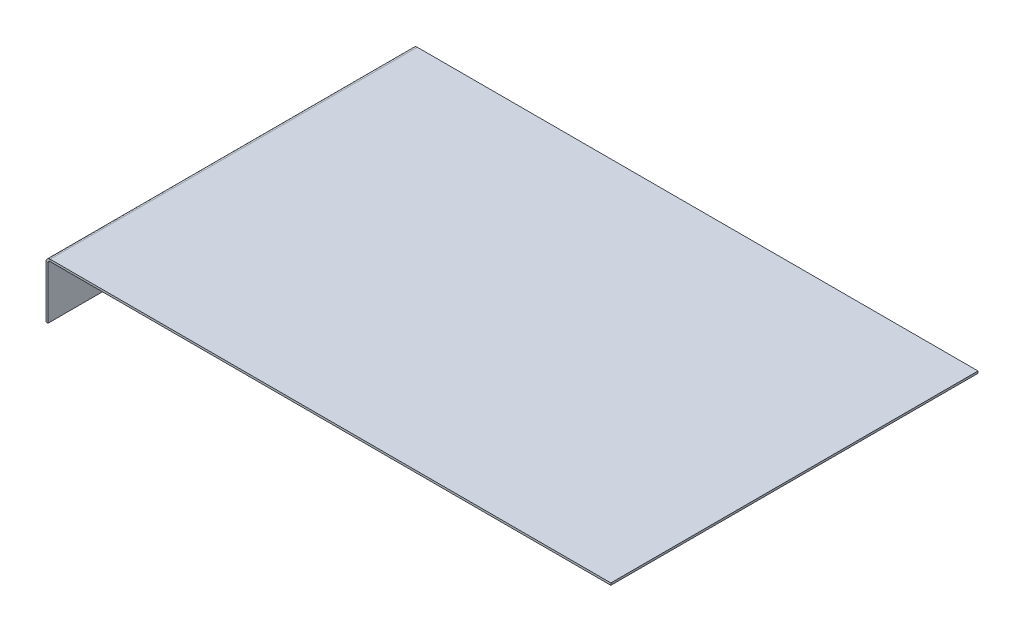
ISO-10303-21;
HEADER;
FILE_DESCRIPTION(('STEP AP214'),'2;1');
FILE_NAME('part.step','',(''),(''),'','','');
FILE_SCHEMA(('AUTOMOTIVE_DESIGN { 1 0 10303 214 1 1 1 1 }'));
ENDSEC;
DATA;
#1=APPLICATION_CONTEXT('core data for automotive mechanical design processes');
#2=APPLICATION_PROTOCOL_DEFINITION('international standard','automotive_design',2000,#1);
#3=PRODUCT_CONTEXT('',#1,'mechanical');
#4=PRODUCT('Part','Part','',(#3));
#5=PRODUCT_RELATED_PRODUCT_CATEGORY('part','',(#4));
#6=PRODUCT_DEFINITION_FORMATION('','',#4);
#7=PRODUCT_DEFINITION_CONTEXT('part definition',#1,'design');
#8=PRODUCT_DEFINITION('design','',#6,#7);
#9=PRODUCT_DEFINITION_SHAPE('','',#8);
#10=(LENGTH_UNIT() NAMED_UNIT(*) SI_UNIT(.MILLI.,.METRE.));
#11=(NAMED_UNIT(*) PLANE_ANGLE_UNIT() SI_UNIT($,.RADIAN.));
#12=(NAMED_UNIT(*) SI_UNIT($,.STERADIAN.) SOLID_ANGLE_UNIT());
#13=UNCERTAINTY_MEASURE_WITH_UNIT(LENGTH_MEASURE(1.E-05),#10,'distance_accuracy_value','');
#14=(GEOMETRIC_REPRESENTATION_CONTEXT(3) GLOBAL_UNCERTAINTY_ASSIGNED_CONTEXT((#13)) GLOBAL_UNIT_ASSIGNED_CONTEXT((#10,
#11,#12)) REPRESENTATION_CONTEXT('',''));
#15=CARTESIAN_POINT('',(0.,0.,0.));
#16=DIRECTION('',(0.,0.,1.));
#17=DIRECTION('',(1.,0.,0.));
#18=AXIS2_PLACEMENT_3D('',#15,#16,#17);
#19=CARTESIAN_POINT('',(-100.,-0.7366,-65.));
#20=DIRECTION('',(0.,0.,-1.));
#21=DIRECTION('',(-1.,0.,0.));
#22=AXIS2_PLACEMENT_3D('',#19,#20,#21);
#23=PLANE('',#22);
#24=DIRECTION('',(-1.,0.,0.));
#25=VECTOR('',#24,1.);
#26=CARTESIAN_POINT('',(-100.,-0.7366,-65.));
#27=LINE('',#26,#25);
#28=CARTESIAN_POINT('',(100.,-0.7366,-65.));
#29=VERTEX_POINT('',#28);
#30=CARTESIAN_POINT('',(-98.5268,-0.7366,-65.));
#31=VERTEX_POINT('',#30);
#32=EDGE_CURVE('E188',#29,#31,#27,.T.);
#33=ORIENTED_EDGE('',*,*,#32,.T.);
#34=DIRECTION('',(0.,1.,0.));
#35=VECTOR('',#34,1.);
#36=CARTESIAN_POINT('',(-98.5268,-0.736600000000006,-65.));
#37=LINE('',#36,#35);
#38=CARTESIAN_POINT('',(-98.5268,0.,-65.));
#39=VERTEX_POINT('',#38);
#40=EDGE_CURVE('E172',#31,#39,#37,.T.);
#41=ORIENTED_EDGE('',*,*,#40,.T.);
#42=DIRECTION('',(-1.,0.,0.));
#43=VECTOR('',#42,1.);
#44=CARTESIAN_POINT('',(-100.,0.,-65.));
#45=LINE('',#44,#43);
#46=CARTESIAN_POINT('',(100.,0.,-65.));
#47=VERTEX_POINT('',#46);
#48=EDGE_CURVE('E195',#47,#39,#45,.T.);
#49=ORIENTED_EDGE('',*,*,#48,.F.);
#50=DIRECTION('',(0.,1.,0.));
#51=VECTOR('',#50,1.);
#52=CARTESIAN_POINT('',(100.,-0.7366,-65.));
#53=LINE('',#52,#51);
#54=EDGE_CURVE('E61',#29,#47,#53,.T.);
#55=ORIENTED_EDGE('',*,*,#54,.F.);
#56=EDGE_LOOP('',(#33,#41,#49,#55));
#57=FACE_BOUND('',#56,.T.);
#58=ADVANCED_FACE('F57',(#57),#23,.T.);
#59=CARTESIAN_POINT('',(0.,-0.7366,0.));
#60=DIRECTION('',(0.,-1.,0.));
#61=DIRECTION('',(0.,0.,-1.));
#62=AXIS2_PLACEMENT_3D('',#59,#60,#61);
#63=PLANE('',#62);
#64=DIRECTION('',(1.,0.,0.));
#65=VECTOR('',#64,1.);
#66=CARTESIAN_POINT('',(-100.,-0.7366,65.));
#67=LINE('',#66,#65);
#68=CARTESIAN_POINT('',(-98.5268,-0.7366,65.));
#69=VERTEX_POINT('',#68);
#70=CARTESIAN_POINT('',(100.,-0.7366,65.));
#71=VERTEX_POINT('',#70);
#72=EDGE_CURVE('E191',#69,#71,#67,.T.);
#73=ORIENTED_EDGE('',*,*,#72,.F.);
#74=DIRECTION('',(0.,0.,-1.));
#75=VECTOR('',#74,1.);
#76=CARTESIAN_POINT('',(-98.5268,-0.736600000000006,-65.));
#77=LINE('',#76,#75);
#78=EDGE_CURVE('E72',#31,#69,#77,.F.);
#79=ORIENTED_EDGE('',*,*,#78,.F.);
#80=ORIENTED_EDGE('',*,*,#32,.F.);
#81=DIRECTION('',(0.,0.,-1.));
#82=VECTOR('',#81,1.);
#83=CARTESIAN_POINT('',(100.,-0.7366,65.));
#84=LINE('',#83,#82);
#85=EDGE_CURVE('E185',#71,#29,#84,.T.);
#86=ORIENTED_EDGE('',*,*,#85,.F.);
#87=EDGE_LOOP('',(#73,#79,#80,#86));
#88=FACE_BOUND('',#87,.T.);
#89=ADVANCED_FACE('F237',(#88),#63,.T.);
#90=CARTESIAN_POINT('',(0.,0.,0.));
#91=DIRECTION('',(0.,-1.,0.));
#92=DIRECTION('',(0.,0.,-1.));
#93=AXIS2_PLACEMENT_3D('',#90,#91,#92);
#94=PLANE('',#93);
#95=DIRECTION('',(0.,0.,-1.));
#96=VECTOR('',#95,1.);
#97=CARTESIAN_POINT('',(-98.5268,0.,-65.));
#98=LINE('',#97,#96);
#99=CARTESIAN_POINT('',(-98.5268,0.,65.));
#100=VERTEX_POINT('',#99);
#101=EDGE_CURVE('E166',#39,#100,#98,.F.);
#102=ORIENTED_EDGE('',*,*,#101,.T.);
#103=DIRECTION('',(1.,0.,0.));
#104=VECTOR('',#103,1.);
#105=CARTESIAN_POINT('',(-100.,0.,65.));
#106=LINE('',#105,#104);
#107=CARTESIAN_POINT('',(100.,0.,65.));
#108=VERTEX_POINT('',#107);
#109=EDGE_CURVE('E189',#100,#108,#106,.T.);
#110=ORIENTED_EDGE('',*,*,#109,.T.);
#111=DIRECTION('',(0.,0.,-1.));
#112=VECTOR('',#111,1.);
#113=CARTESIAN_POINT('',(100.,0.,65.));
#114=LINE('',#113,#112);
#115=EDGE_CURVE('E183',#108,#47,#114,.T.);
#116=ORIENTED_EDGE('',*,*,#115,.T.);
#117=ORIENTED_EDGE('',*,*,#48,.T.);
#118=EDGE_LOOP('',(#102,#110,#116,#117));
#119=FACE_BOUND('',#118,.T.);
#120=ADVANCED_FACE('F199',(#119),#94,.F.);
#121=CARTESIAN_POINT('',(100.,-0.7366,65.));
#122=DIRECTION('',(1.,0.,0.));
#123=DIRECTION('',(0.,0.,-1.));
#124=AXIS2_PLACEMENT_3D('',#121,#122,#123);
#125=PLANE('',#124);
#126=ORIENTED_EDGE('',*,*,#115,.F.);
#127=DIRECTION('',(0.,1.,0.));
#128=VECTOR('',#127,1.);
#129=CARTESIAN_POINT('',(100.,-0.7366,65.));
#130=LINE('',#129,#128);
#131=EDGE_CURVE('E13',#71,#108,#130,.T.);
#132=ORIENTED_EDGE('',*,*,#131,.F.);
#133=ORIENTED_EDGE('',*,*,#85,.T.);
#134=ORIENTED_EDGE('',*,*,#54,.T.);
#135=EDGE_LOOP('',(#126,#132,#133,#134));
#136=FACE_BOUND('',#135,.T.);
#137=ADVANCED_FACE('F59',(#136),#125,.T.);
#138=CARTESIAN_POINT('',(-100.,-0.7366,65.));
#139=DIRECTION('',(0.,0.,1.));
#140=DIRECTION('',(1.,0.,0.));
#141=AXIS2_PLACEMENT_3D('',#138,#139,#140);
#142=PLANE('',#141);
#143=DIRECTION('',(0.,1.,0.));
#144=VECTOR('',#143,1.);
#145=CARTESIAN_POINT('',(-98.5268,-0.736600000000006,65.));
#146=LINE('',#145,#144);
#147=EDGE_CURVE('E80',#69,#100,#146,.T.);
#148=ORIENTED_EDGE('',*,*,#147,.F.);
#149=ORIENTED_EDGE('',*,*,#72,.T.);
#150=ORIENTED_EDGE('',*,*,#131,.T.);
#151=ORIENTED_EDGE('',*,*,#109,.F.);
#152=EDGE_LOOP('',(#148,#149,#150,#151));
#153=FACE_BOUND('',#152,.T.);
#154=ADVANCED_FACE('F203',(#153),#142,.T.);
#155=CARTESIAN_POINT('',(-98.5268,-1.47320000000001,65.));
#156=DIRECTION('',(0.,0.,1.));
#157=DIRECTION('',(1.,0.,0.));
#158=AXIS2_PLACEMENT_3D('',#155,#156,#157);
#159=PLANE('',#158);
#160=DIRECTION('',(1.,0.,0.));
#161=VECTOR('',#160,1.);
#162=CARTESIAN_POINT('',(-100.,-1.47320000000001,65.));
#163=LINE('',#162,#161);
#164=CARTESIAN_POINT('',(-99.2634,-1.47320000000001,65.));
#165=VERTEX_POINT('',#164);
#166=CARTESIAN_POINT('',(-100.,-1.47320000000001,65.));
#167=VERTEX_POINT('',#166);
#168=EDGE_CURVE('E148',#165,#167,#163,.F.);
#169=ORIENTED_EDGE('',*,*,#168,.F.);
#170=CARTESIAN_POINT('',(-98.5268,-1.47320000000001,65.));
#171=DIRECTION('',(0.,0.,-1.));
#172=DIRECTION('',(-1.,0.,0.));
#173=AXIS2_PLACEMENT_3D('',#170,#171,#172);
#174=CIRCLE('',#173,0.736600000000004);
#175=EDGE_CURVE('E175',#69,#165,#174,.F.);
#176=ORIENTED_EDGE('',*,*,#175,.F.);
#177=ORIENTED_EDGE('',*,*,#147,.T.);
#178=CARTESIAN_POINT('',(-98.5268,-1.47320000000001,65.));
#179=DIRECTION('',(0.,0.,-1.));
#180=DIRECTION('',(-1.,0.,0.));
#181=AXIS2_PLACEMENT_3D('',#178,#179,#180);
#182=CIRCLE('',#181,1.4732);
#183=EDGE_CURVE('E168',#100,#167,#182,.F.);
#184=ORIENTED_EDGE('',*,*,#183,.T.);
#185=EDGE_LOOP('',(#169,#176,#177,#184));
#186=FACE_BOUND('',#185,.T.);
#187=ADVANCED_FACE('F226',(#186),#159,.T.);
#188=CARTESIAN_POINT('',(-98.5268,-1.47320000000001,-65.));
#189=DIRECTION('',(0.,0.,1.));
#190=DIRECTION('',(1.,0.,0.));
#191=AXIS2_PLACEMENT_3D('',#188,#189,#190);
#192=PLANE('',#191);
#193=CARTESIAN_POINT('',(-98.5268,-1.47320000000001,-65.));
#194=DIRECTION('',(0.,0.,-1.));
#195=DIRECTION('',(-1.,0.,0.));
#196=AXIS2_PLACEMENT_3D('',#193,#194,#195);
#197=CIRCLE('',#196,0.736600000000004);
#198=CARTESIAN_POINT('',(-99.2634,-1.47320000000001,-65.));
#199=VERTEX_POINT('',#198);
#200=EDGE_CURVE('E179',#199,#31,#197,.T.);
#201=ORIENTED_EDGE('',*,*,#200,.F.);
#202=DIRECTION('',(1.,0.,0.));
#203=VECTOR('',#202,1.);
#204=CARTESIAN_POINT('',(-99.2634,-1.47320000000001,-65.));
#205=LINE('',#204,#203);
#206=CARTESIAN_POINT('',(-100.,-1.47320000000001,-65.));
#207=VERTEX_POINT('',#206);
#208=EDGE_CURVE('E160',#199,#207,#205,.F.);
#209=ORIENTED_EDGE('',*,*,#208,.T.);
#210=CARTESIAN_POINT('',(-98.5268,-1.47320000000001,-65.));
#211=DIRECTION('',(0.,0.,-1.));
#212=DIRECTION('',(-1.,0.,0.));
#213=AXIS2_PLACEMENT_3D('',#210,#211,#212);
#214=CIRCLE('',#213,1.4732);
#215=EDGE_CURVE('E169',#207,#39,#214,.T.);
#216=ORIENTED_EDGE('',*,*,#215,.T.);
#217=ORIENTED_EDGE('',*,*,#40,.F.);
#218=EDGE_LOOP('',(#201,#209,#216,#217));
#219=FACE_BOUND('',#218,.T.);
#220=ADVANCED_FACE('F214',(#219),#192,.F.);
#221=CARTESIAN_POINT('',(-98.5268,-1.47320000000001,-65.));
#222=DIRECTION('',(0.,0.,-1.));
#223=DIRECTION('',(-1.,0.,0.));
#224=AXIS2_PLACEMENT_3D('',#221,#222,#223);
#225=CYLINDRICAL_SURFACE('',#224,1.4732);
#226=ORIENTED_EDGE('',*,*,#101,.F.);
#227=ORIENTED_EDGE('',*,*,#215,.F.);
#228=DIRECTION('',(0.,0.,-1.));
#229=VECTOR('',#228,1.);
#230=CARTESIAN_POINT('',(-100.,-1.47320000000001,65.));
#231=LINE('',#230,#229);
#232=EDGE_CURVE('E158',#207,#167,#231,.F.);
#233=ORIENTED_EDGE('',*,*,#232,.T.);
#234=ORIENTED_EDGE('',*,*,#183,.F.);
#235=EDGE_LOOP('',(#226,#227,#233,#234));
#236=FACE_BOUND('',#235,.T.);
#237=ADVANCED_FACE('F211',(#236),#225,.T.);
#238=CARTESIAN_POINT('',(-98.5268,-1.47320000000001,-65.));
#239=DIRECTION('',(0.,0.,-1.));
#240=DIRECTION('',(-1.,0.,0.));
#241=AXIS2_PLACEMENT_3D('',#238,#239,#240);
#242=CYLINDRICAL_SURFACE('',#241,0.736600000000004);
#243=ORIENTED_EDGE('',*,*,#78,.T.);
#244=ORIENTED_EDGE('',*,*,#175,.T.);
#245=DIRECTION('',(0.,0.,-1.));
#246=VECTOR('',#245,1.);
#247=CARTESIAN_POINT('',(-99.2634,-1.47320000000001,65.));
#248=LINE('',#247,#246);
#249=EDGE_CURVE('E163',#165,#199,#248,.T.);
#250=ORIENTED_EDGE('',*,*,#249,.T.);
#251=ORIENTED_EDGE('',*,*,#200,.T.);
#252=EDGE_LOOP('',(#243,#244,#250,#251));
#253=FACE_BOUND('',#252,.T.);
#254=ADVANCED_FACE('F223',(#253),#242,.F.);
#255=CARTESIAN_POINT('',(-100.,-20.,-65.));
#256=DIRECTION('',(0.,0.,1.));
#257=DIRECTION('',(1.,0.,0.));
#258=AXIS2_PLACEMENT_3D('',#255,#256,#257);
#259=PLANE('',#258);
#260=ORIENTED_EDGE('',*,*,#208,.F.);
#261=DIRECTION('',(0.,1.,0.));
#262=VECTOR('',#261,1.);
#263=CARTESIAN_POINT('',(-99.2634,-20.,-65.));
#264=LINE('',#263,#262);
#265=CARTESIAN_POINT('',(-99.2634,-20.,-65.));
#266=VERTEX_POINT('',#265);
#267=EDGE_CURVE('E156',#199,#266,#264,.F.);
#268=ORIENTED_EDGE('',*,*,#267,.T.);
#269=DIRECTION('',(1.,0.,0.));
#270=VECTOR('',#269,1.);
#271=CARTESIAN_POINT('',(-100.,-20.,-65.));
#272=LINE('',#271,#270);
#273=CARTESIAN_POINT('',(-100.,-20.,-65.));
#274=VERTEX_POINT('',#273);
#275=EDGE_CURVE('E144',#274,#266,#272,.T.);
#276=ORIENTED_EDGE('',*,*,#275,.F.);
#277=DIRECTION('',(0.,-1.,0.));
#278=VECTOR('',#277,1.);
#279=CARTESIAN_POINT('',(-100.,3.62783101663387E-13,-65.));
#280=LINE('',#279,#278);
#281=EDGE_CURVE('E131',#207,#274,#280,.T.);
#282=ORIENTED_EDGE('',*,*,#281,.F.);
#283=EDGE_LOOP('',(#260,#268,#276,#282));
#284=FACE_BOUND('',#283,.T.);
#285=ADVANCED_FACE('F218',(#284),#259,.F.);
#286=CARTESIAN_POINT('',(-100.,-0.736599999999997,65.));
#287=DIRECTION('',(0.,0.,-1.));
#288=DIRECTION('',(-1.,0.,0.));
#289=AXIS2_PLACEMENT_3D('',#286,#287,#288);
#290=PLANE('',#289);
#291=ORIENTED_EDGE('',*,*,#168,.T.);
#292=DIRECTION('',(0.,1.,0.));
#293=VECTOR('',#292,1.);
#294=CARTESIAN_POINT('',(-100.,3.62783101663387E-13,65.));
#295=LINE('',#294,#293);
#296=CARTESIAN_POINT('',(-100.,-20.,65.));
#297=VERTEX_POINT('',#296);
#298=EDGE_CURVE('E129',#297,#167,#295,.T.);
#299=ORIENTED_EDGE('',*,*,#298,.F.);
#300=DIRECTION('',(1.,0.,0.));
#301=VECTOR('',#300,1.);
#302=CARTESIAN_POINT('',(-100.,-20.,65.));
#303=LINE('',#302,#301);
#304=CARTESIAN_POINT('',(-99.2634,-20.,65.));
#305=VERTEX_POINT('',#304);
#306=EDGE_CURVE('E137',#297,#305,#303,.T.);
#307=ORIENTED_EDGE('',*,*,#306,.T.);
#308=DIRECTION('',(0.,-1.,0.));
#309=VECTOR('',#308,1.);
#310=CARTESIAN_POINT('',(-99.2634,-0.7366,65.));
#311=LINE('',#310,#309);
#312=EDGE_CURVE('E153',#305,#165,#311,.F.);
#313=ORIENTED_EDGE('',*,*,#312,.T.);
#314=EDGE_LOOP('',(#291,#299,#307,#313));
#315=FACE_BOUND('',#314,.T.);
#316=ADVANCED_FACE('F147',(#315),#290,.F.);
#317=CARTESIAN_POINT('',(-100.,3.62783101663387E-13,0.));
#318=DIRECTION('',(1.,0.,0.));
#319=DIRECTION('',(0.,1.,0.));
#320=AXIS2_PLACEMENT_3D('',#317,#318,#319);
#321=PLANE('',#320);
#322=ORIENTED_EDGE('',*,*,#232,.F.);
#323=ORIENTED_EDGE('',*,*,#281,.T.);
#324=DIRECTION('',(0.,0.,1.));
#325=VECTOR('',#324,1.);
#326=CARTESIAN_POINT('',(-100.,-20.,0.));
#327=LINE('',#326,#325);
#328=EDGE_CURVE('E124',#274,#297,#327,.T.);
#329=ORIENTED_EDGE('',*,*,#328,.T.);
#330=ORIENTED_EDGE('',*,*,#298,.T.);
#331=EDGE_LOOP('',(#322,#323,#329,#330));
#332=FACE_BOUND('',#331,.T.);
#333=ADVANCED_FACE('F127',(#332),#321,.F.);
#334=CARTESIAN_POINT('',(-99.2634,3.60211276509195E-13,0.));
#335=DIRECTION('',(1.,0.,0.));
#336=DIRECTION('',(0.,1.,0.));
#337=AXIS2_PLACEMENT_3D('',#334,#335,#336);
#338=PLANE('',#337);
#339=ORIENTED_EDGE('',*,*,#267,.F.);
#340=ORIENTED_EDGE('',*,*,#249,.F.);
#341=ORIENTED_EDGE('',*,*,#312,.F.);
#342=DIRECTION('',(0.,0.,-1.));
#343=VECTOR('',#342,1.);
#344=CARTESIAN_POINT('',(-99.2634,-20.,65.));
#345=LINE('',#344,#343);
#346=EDGE_CURVE('E140',#266,#305,#345,.F.);
#347=ORIENTED_EDGE('',*,*,#346,.F.);
#348=EDGE_LOOP('',(#339,#340,#341,#347));
#349=FACE_BOUND('',#348,.T.);
#350=ADVANCED_FACE('F221',(#349),#338,.T.);
#351=CARTESIAN_POINT('',(-100.,-20.,65.));
#352=DIRECTION('',(0.,1.,0.));
#353=DIRECTION('',(-1.,0.,0.));
#354=AXIS2_PLACEMENT_3D('',#351,#352,#353);
#355=PLANE('',#354);
#356=ORIENTED_EDGE('',*,*,#346,.T.);
#357=ORIENTED_EDGE('',*,*,#306,.F.);
#358=ORIENTED_EDGE('',*,*,#328,.F.);
#359=ORIENTED_EDGE('',*,*,#275,.T.);
#360=EDGE_LOOP('',(#356,#357,#358,#359));
#361=FACE_BOUND('',#360,.T.);
#362=ADVANCED_FACE('F138',(#361),#355,.F.);
#363=CLOSED_SHELL('',(#58,#89,#120,#137,#154,#187,#220,#237,#254,#285,#316,#333,#350,#362));
#364=MANIFOLD_SOLID_BREP('B2',#363);
#365=ADVANCED_BREP_SHAPE_REPRESENTATION('',(#18,#364),#14);
#366=SHAPE_DEFINITION_REPRESENTATION(#9,#365);
ENDSEC;
END-ISO-10303-21;
